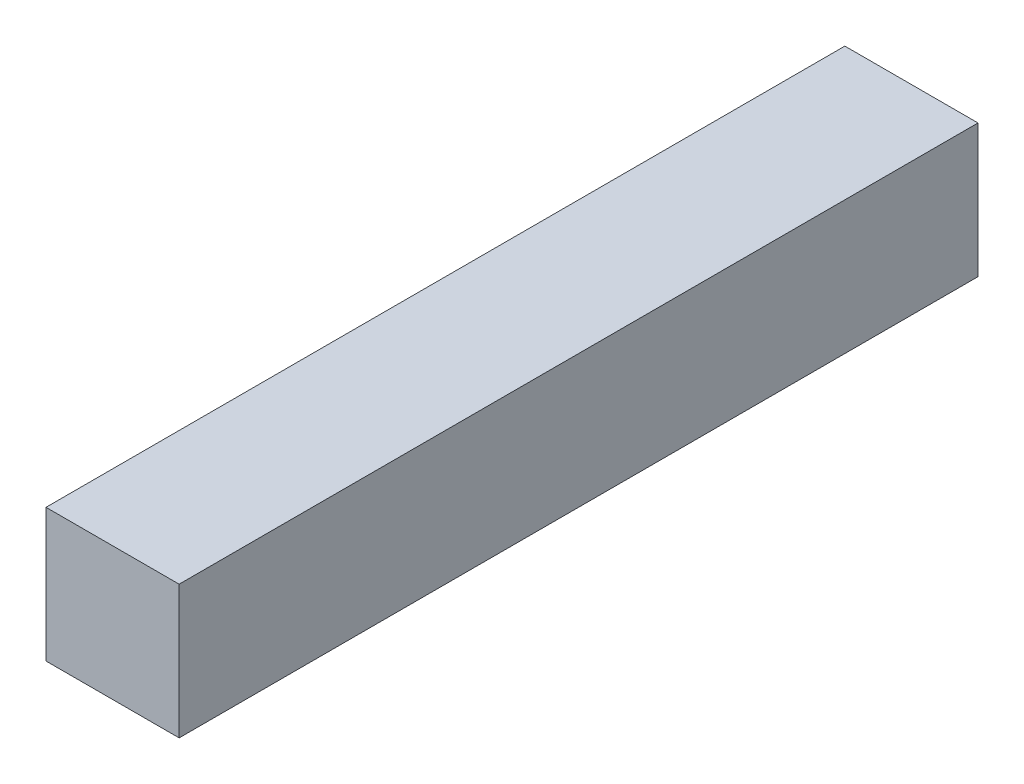
ISO-10303-21;
HEADER;
FILE_DESCRIPTION(('STEP AP214'),'2;1');
FILE_NAME('part.step','',(''),(''),'','','');
FILE_SCHEMA(('AUTOMOTIVE_DESIGN { 1 0 10303 214 1 1 1 1 }'));
ENDSEC;
DATA;
#1=APPLICATION_CONTEXT('core data for automotive mechanical design processes');
#2=APPLICATION_PROTOCOL_DEFINITION('international standard','automotive_design',2000,#1);
#3=PRODUCT_CONTEXT('',#1,'mechanical');
#4=PRODUCT('Part','Part','',(#3));
#5=PRODUCT_RELATED_PRODUCT_CATEGORY('part','',(#4));
#6=PRODUCT_DEFINITION_FORMATION('','',#4);
#7=PRODUCT_DEFINITION_CONTEXT('part definition',#1,'design');
#8=PRODUCT_DEFINITION('design','',#6,#7);
#9=PRODUCT_DEFINITION_SHAPE('','',#8);
#10=(LENGTH_UNIT() NAMED_UNIT(*) SI_UNIT(.MILLI.,.METRE.));
#11=(NAMED_UNIT(*) PLANE_ANGLE_UNIT() SI_UNIT($,.RADIAN.));
#12=(NAMED_UNIT(*) SI_UNIT($,.STERADIAN.) SOLID_ANGLE_UNIT());
#13=UNCERTAINTY_MEASURE_WITH_UNIT(LENGTH_MEASURE(1.E-05),#10,'distance_accuracy_value','');
#14=(GEOMETRIC_REPRESENTATION_CONTEXT(3) GLOBAL_UNCERTAINTY_ASSIGNED_CONTEXT((#13)) GLOBAL_UNIT_ASSIGNED_CONTEXT((#10,
#11,#12)) REPRESENTATION_CONTEXT('',''));
#15=CARTESIAN_POINT('',(0.,0.,0.));
#16=DIRECTION('',(0.,0.,1.));
#17=DIRECTION('',(1.,0.,0.));
#18=AXIS2_PLACEMENT_3D('',#15,#16,#17);
#19=CARTESIAN_POINT('',(12.5,12.5,75.));
#20=DIRECTION('',(-1.,0.,0.));
#21=DIRECTION('',(0.,-1.,0.));
#22=AXIS2_PLACEMENT_3D('',#19,#20,#21);
#23=PLANE('',#22);
#24=DIRECTION('',(0.,1.,0.));
#25=VECTOR('',#24,1.);
#26=CARTESIAN_POINT('',(12.5,12.5,-75.));
#27=LINE('',#26,#25);
#28=CARTESIAN_POINT('',(12.5,-12.5,-75.));
#29=VERTEX_POINT('',#28);
#30=CARTESIAN_POINT('',(12.5,12.5,-75.));
#31=VERTEX_POINT('',#30);
#32=EDGE_CURVE('E102',#29,#31,#27,.T.);
#33=ORIENTED_EDGE('',*,*,#32,.T.);
#34=DIRECTION('',(0.,0.,-1.));
#35=VECTOR('',#34,1.);
#36=CARTESIAN_POINT('',(12.5,12.5,75.));
#37=LINE('',#36,#35);
#38=CARTESIAN_POINT('',(12.5,12.5,75.));
#39=VERTEX_POINT('',#38);
#40=EDGE_CURVE('E11',#39,#31,#37,.T.);
#41=ORIENTED_EDGE('',*,*,#40,.F.);
#42=DIRECTION('',(0.,1.,0.));
#43=VECTOR('',#42,1.);
#44=CARTESIAN_POINT('',(12.5,12.5,75.));
#45=LINE('',#44,#43);
#46=CARTESIAN_POINT('',(12.5,-12.5,75.));
#47=VERTEX_POINT('',#46);
#48=EDGE_CURVE('E90',#47,#39,#45,.T.);
#49=ORIENTED_EDGE('',*,*,#48,.F.);
#50=DIRECTION('',(0.,0.,-1.));
#51=VECTOR('',#50,1.);
#52=CARTESIAN_POINT('',(12.5,-12.5,75.));
#53=LINE('',#52,#51);
#54=EDGE_CURVE('E98',#47,#29,#53,.T.);
#55=ORIENTED_EDGE('',*,*,#54,.T.);
#56=EDGE_LOOP('',(#33,#41,#49,#55));
#57=FACE_BOUND('',#56,.T.);
#58=ADVANCED_FACE('F39',(#57),#23,.F.);
#59=CARTESIAN_POINT('',(-12.5,12.5,75.));
#60=DIRECTION('',(0.,-1.,0.));
#61=DIRECTION('',(0.,0.,-1.));
#62=AXIS2_PLACEMENT_3D('',#59,#60,#61);
#63=PLANE('',#62);
#64=DIRECTION('',(-1.,0.,0.));
#65=VECTOR('',#64,1.);
#66=CARTESIAN_POINT('',(-12.5,12.5,-75.));
#67=LINE('',#66,#65);
#68=CARTESIAN_POINT('',(-12.5,12.5,-75.));
#69=VERTEX_POINT('',#68);
#70=EDGE_CURVE('E94',#31,#69,#67,.T.);
#71=ORIENTED_EDGE('',*,*,#70,.T.);
#72=DIRECTION('',(0.,0.,-1.));
#73=VECTOR('',#72,1.);
#74=CARTESIAN_POINT('',(-12.5,12.5,75.));
#75=LINE('',#74,#73);
#76=CARTESIAN_POINT('',(-12.5,12.5,75.));
#77=VERTEX_POINT('',#76);
#78=EDGE_CURVE('E47',#77,#69,#75,.T.);
#79=ORIENTED_EDGE('',*,*,#78,.F.);
#80=DIRECTION('',(-1.,0.,0.));
#81=VECTOR('',#80,1.);
#82=CARTESIAN_POINT('',(-12.5,12.5,75.));
#83=LINE('',#82,#81);
#84=EDGE_CURVE('E85',#39,#77,#83,.T.);
#85=ORIENTED_EDGE('',*,*,#84,.F.);
#86=ORIENTED_EDGE('',*,*,#40,.T.);
#87=EDGE_LOOP('',(#71,#79,#85,#86));
#88=FACE_BOUND('',#87,.T.);
#89=ADVANCED_FACE('F93',(#88),#63,.F.);
#90=CARTESIAN_POINT('',(-12.5,12.5,75.));
#91=DIRECTION('',(1.,0.,0.));
#92=DIRECTION('',(0.,1.,0.));
#93=AXIS2_PLACEMENT_3D('',#90,#91,#92);
#94=PLANE('',#93);
#95=DIRECTION('',(0.,-1.,0.));
#96=VECTOR('',#95,1.);
#97=CARTESIAN_POINT('',(-12.5,12.5,-75.));
#98=LINE('',#97,#96);
#99=CARTESIAN_POINT('',(-12.5,-12.5,-75.));
#100=VERTEX_POINT('',#99);
#101=EDGE_CURVE('E72',#69,#100,#98,.T.);
#102=ORIENTED_EDGE('',*,*,#101,.T.);
#103=DIRECTION('',(0.,0.,-1.));
#104=VECTOR('',#103,1.);
#105=CARTESIAN_POINT('',(-12.5,-12.5,75.));
#106=LINE('',#105,#104);
#107=CARTESIAN_POINT('',(-12.5,-12.5,75.));
#108=VERTEX_POINT('',#107);
#109=EDGE_CURVE('E95',#108,#100,#106,.T.);
#110=ORIENTED_EDGE('',*,*,#109,.F.);
#111=DIRECTION('',(0.,-1.,0.));
#112=VECTOR('',#111,1.);
#113=CARTESIAN_POINT('',(-12.5,12.5,75.));
#114=LINE('',#113,#112);
#115=EDGE_CURVE('E88',#77,#108,#114,.T.);
#116=ORIENTED_EDGE('',*,*,#115,.F.);
#117=ORIENTED_EDGE('',*,*,#78,.T.);
#118=EDGE_LOOP('',(#102,#110,#116,#117));
#119=FACE_BOUND('',#118,.T.);
#120=ADVANCED_FACE('F96',(#119),#94,.F.);
#121=CARTESIAN_POINT('',(-12.5,-12.5,75.));
#122=DIRECTION('',(0.,1.,0.));
#123=DIRECTION('',(0.,0.,1.));
#124=AXIS2_PLACEMENT_3D('',#121,#122,#123);
#125=PLANE('',#124);
#126=DIRECTION('',(1.,0.,0.));
#127=VECTOR('',#126,1.);
#128=CARTESIAN_POINT('',(-12.5,-12.5,-75.));
#129=LINE('',#128,#127);
#130=EDGE_CURVE('E78',#100,#29,#129,.T.);
#131=ORIENTED_EDGE('',*,*,#130,.T.);
#132=ORIENTED_EDGE('',*,*,#54,.F.);
#133=DIRECTION('',(1.,0.,0.));
#134=VECTOR('',#133,1.);
#135=CARTESIAN_POINT('',(-12.5,-12.5,75.));
#136=LINE('',#135,#134);
#137=EDGE_CURVE('E55',#108,#47,#136,.T.);
#138=ORIENTED_EDGE('',*,*,#137,.F.);
#139=ORIENTED_EDGE('',*,*,#109,.T.);
#140=EDGE_LOOP('',(#131,#132,#138,#139));
#141=FACE_BOUND('',#140,.T.);
#142=ADVANCED_FACE('F109',(#141),#125,.F.);
#143=CARTESIAN_POINT('',(0.,0.,75.));
#144=DIRECTION('',(0.,0.,1.));
#145=DIRECTION('',(1.,0.,0.));
#146=AXIS2_PLACEMENT_3D('',#143,#144,#145);
#147=PLANE('',#146);
#148=ORIENTED_EDGE('',*,*,#48,.T.);
#149=ORIENTED_EDGE('',*,*,#84,.T.);
#150=ORIENTED_EDGE('',*,*,#115,.T.);
#151=ORIENTED_EDGE('',*,*,#137,.T.);
#152=EDGE_LOOP('',(#148,#149,#150,#151));
#153=FACE_BOUND('',#152,.T.);
#154=ADVANCED_FACE('F86',(#153),#147,.T.);
#155=CARTESIAN_POINT('',(0.,0.,-75.));
#156=DIRECTION('',(0.,0.,1.));
#157=DIRECTION('',(1.,0.,0.));
#158=AXIS2_PLACEMENT_3D('',#155,#156,#157);
#159=PLANE('',#158);
#160=ORIENTED_EDGE('',*,*,#32,.F.);
#161=ORIENTED_EDGE('',*,*,#130,.F.);
#162=ORIENTED_EDGE('',*,*,#101,.F.);
#163=ORIENTED_EDGE('',*,*,#70,.F.);
#164=EDGE_LOOP('',(#160,#161,#162,#163));
#165=FACE_BOUND('',#164,.T.);
#166=ADVANCED_FACE('F112',(#165),#159,.F.);
#167=CLOSED_SHELL('',(#58,#89,#120,#142,#154,#166));
#168=MANIFOLD_SOLID_BREP('B2',#167);
#169=ADVANCED_BREP_SHAPE_REPRESENTATION('',(#18,#168),#14);
#170=SHAPE_DEFINITION_REPRESENTATION(#9,#169);
ENDSEC;
END-ISO-10303-21;
